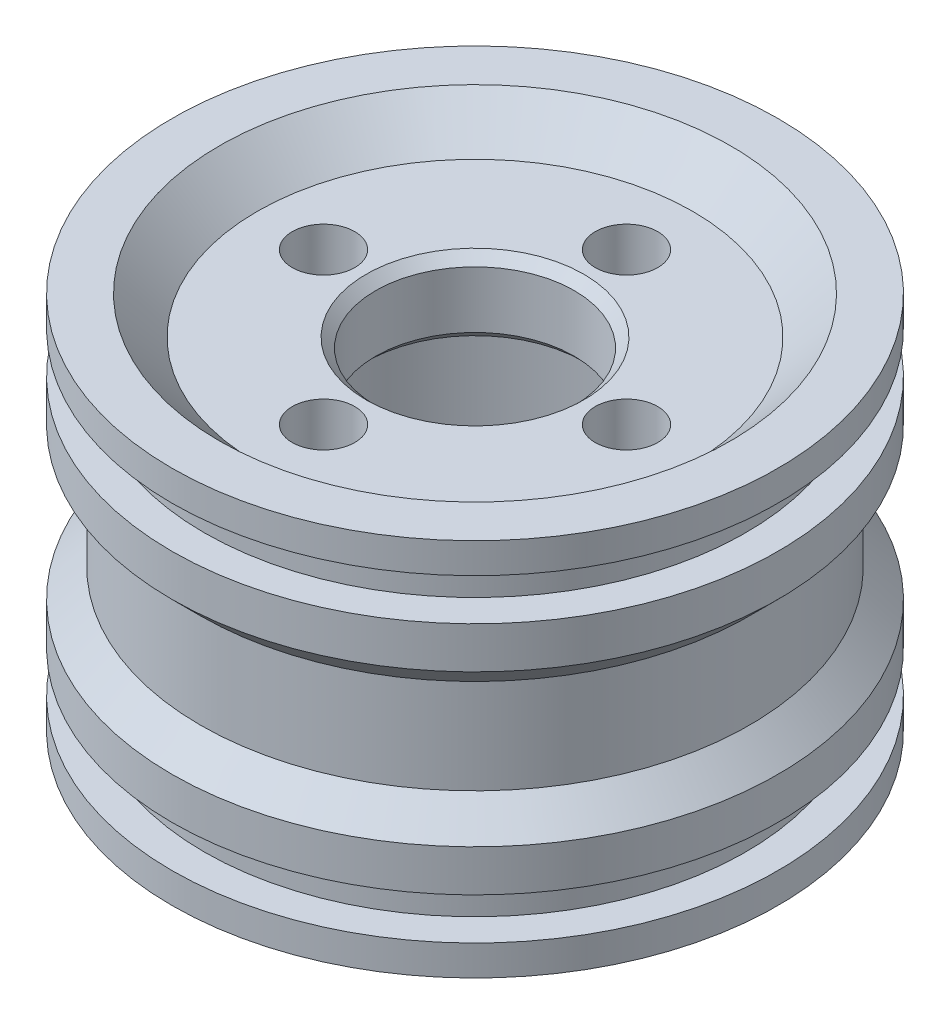
ISO-10303-21;
HEADER;
FILE_DESCRIPTION(('STEP AP214'),'2;1');
FILE_NAME('part.step','',(''),(''),'','','');
FILE_SCHEMA(('AUTOMOTIVE_DESIGN { 1 0 10303 214 1 1 1 1 }'));
ENDSEC;
DATA;
#1=APPLICATION_CONTEXT('core data for automotive mechanical design processes');
#2=APPLICATION_PROTOCOL_DEFINITION('international standard','automotive_design',2000,#1);
#3=PRODUCT_CONTEXT('',#1,'mechanical');
#4=PRODUCT('Part','Part','',(#3));
#5=PRODUCT_RELATED_PRODUCT_CATEGORY('part','',(#4));
#6=PRODUCT_DEFINITION_FORMATION('','',#4);
#7=PRODUCT_DEFINITION_CONTEXT('part definition',#1,'design');
#8=PRODUCT_DEFINITION('design','',#6,#7);
#9=PRODUCT_DEFINITION_SHAPE('','',#8);
#10=(LENGTH_UNIT() NAMED_UNIT(*) SI_UNIT(.MILLI.,.METRE.));
#11=(NAMED_UNIT(*) PLANE_ANGLE_UNIT() SI_UNIT($,.RADIAN.));
#12=(NAMED_UNIT(*) SI_UNIT($,.STERADIAN.) SOLID_ANGLE_UNIT());
#13=UNCERTAINTY_MEASURE_WITH_UNIT(LENGTH_MEASURE(1.E-05),#10,'distance_accuracy_value','');
#14=(GEOMETRIC_REPRESENTATION_CONTEXT(3) GLOBAL_UNCERTAINTY_ASSIGNED_CONTEXT((#13)) GLOBAL_UNIT_ASSIGNED_CONTEXT((#10,
#11,#12)) REPRESENTATION_CONTEXT('',''));
#15=CARTESIAN_POINT('',(0.,0.,0.));
#16=DIRECTION('',(0.,0.,1.));
#17=DIRECTION('',(1.,0.,0.));
#18=AXIS2_PLACEMENT_3D('',#15,#16,#17);
#19=CARTESIAN_POINT('',(0.,10.,0.));
#20=DIRECTION('',(0.,-1.,0.));
#21=DIRECTION('',(0.,0.,-1.));
#22=AXIS2_PLACEMENT_3D('',#19,#20,#21);
#23=CYLINDRICAL_SURFACE('',#22,16.);
#24=CARTESIAN_POINT('',(0.,-4.,0.));
#25=DIRECTION('',(0.,-1.,0.));
#26=DIRECTION('',(0.,0.,-1.));
#27=AXIS2_PLACEMENT_3D('',#24,#25,#26);
#28=CIRCLE('',#27,16.);
#29=CARTESIAN_POINT('',(0.,-4.,-16.));
#30=VERTEX_POINT('',#29);
#31=EDGE_CURVE('E136',#30,#30,#28,.T.);
#32=ORIENTED_EDGE('',*,*,#31,.T.);
#33=EDGE_LOOP('',(#32));
#34=FACE_BOUND('',#33,.T.);
#35=CARTESIAN_POINT('',(0.,-6.2,0.));
#36=DIRECTION('',(0.,1.,0.));
#37=DIRECTION('',(0.,0.,1.));
#38=AXIS2_PLACEMENT_3D('',#35,#36,#37);
#39=CIRCLE('',#38,16.);
#40=CARTESIAN_POINT('',(0.,-6.2,16.));
#41=VERTEX_POINT('',#40);
#42=EDGE_CURVE('E116',#41,#41,#39,.T.);
#43=ORIENTED_EDGE('',*,*,#42,.T.);
#44=EDGE_LOOP('',(#43));
#45=FACE_BOUND('',#44,.T.);
#46=ADVANCED_FACE('F41',(#34,#45),#23,.T.);
#47=CARTESIAN_POINT('',(0.,-5.,0.));
#48=DIRECTION('',(0.,1.,0.));
#49=DIRECTION('',(0.,0.,1.));
#50=AXIS2_PLACEMENT_3D('',#47,#48,#49);
#51=CYLINDRICAL_SURFACE('',#50,5.25);
#52=CARTESIAN_POINT('',(0.,7.49999999999999,0.));
#53=DIRECTION('',(0.,1.,0.));
#54=DIRECTION('',(0.,0.,1.));
#55=AXIS2_PLACEMENT_3D('',#52,#53,#54);
#56=CIRCLE('',#55,5.25);
#57=CARTESIAN_POINT('',(0.,7.49999999999999,5.25));
#58=VERTEX_POINT('',#57);
#59=EDGE_CURVE('E57',#58,#58,#56,.T.);
#60=ORIENTED_EDGE('',*,*,#59,.T.);
#61=EDGE_LOOP('',(#60));
#62=FACE_BOUND('',#61,.T.);
#63=CARTESIAN_POINT('',(0.,4.5,0.));
#64=DIRECTION('',(0.,-1.,0.));
#65=DIRECTION('',(0.,0.,-1.));
#66=AXIS2_PLACEMENT_3D('',#63,#64,#65);
#67=CIRCLE('',#66,5.25);
#68=CARTESIAN_POINT('',(0.,4.5,-5.25));
#69=VERTEX_POINT('',#68);
#70=EDGE_CURVE('E62',#69,#69,#67,.T.);
#71=ORIENTED_EDGE('',*,*,#70,.T.);
#72=EDGE_LOOP('',(#71));
#73=FACE_BOUND('',#72,.T.);
#74=ADVANCED_FACE('F154',(#62,#73),#51,.F.);
#75=CARTESIAN_POINT('',(0.,4.,0.));
#76=DIRECTION('',(0.,-1.,0.));
#77=DIRECTION('',(0.,0.,-1.));
#78=AXIS2_PLACEMENT_3D('',#75,#76,#77);
#79=CIRCLE('',#78,16.);
#80=CARTESIAN_POINT('',(0.,4.,-16.));
#81=VERTEX_POINT('',#80);
#82=EDGE_CURVE('E143',#81,#81,#79,.T.);
#83=ORIENTED_EDGE('',*,*,#82,.F.);
#84=EDGE_LOOP('',(#83));
#85=FACE_BOUND('',#84,.T.);
#86=CARTESIAN_POINT('',(0.,6.2,0.));
#87=DIRECTION('',(0.,1.,0.));
#88=DIRECTION('',(0.,0.,1.));
#89=AXIS2_PLACEMENT_3D('',#86,#87,#88);
#90=CIRCLE('',#89,16.);
#91=CARTESIAN_POINT('',(0.,6.2,16.));
#92=VERTEX_POINT('',#91);
#93=EDGE_CURVE('E102',#92,#92,#90,.T.);
#94=ORIENTED_EDGE('',*,*,#93,.F.);
#95=EDGE_LOOP('',(#94));
#96=FACE_BOUND('',#95,.T.);
#97=ADVANCED_FACE('F150',(#85,#96),#23,.T.);
#98=CARTESIAN_POINT('',(16.,6.2,0.));
#99=DIRECTION('',(0.,1.,0.));
#100=DIRECTION('',(0.,0.,1.));
#101=AXIS2_PLACEMENT_3D('',#98,#99,#100);
#102=PLANE('',#101);
#103=ORIENTED_EDGE('',*,*,#93,.T.);
#104=EDGE_LOOP('',(#103));
#105=FACE_BOUND('',#104,.T.);
#106=CARTESIAN_POINT('',(0.,6.2,0.));
#107=DIRECTION('',(0.,1.,0.));
#108=DIRECTION('',(0.,0.,1.));
#109=AXIS2_PLACEMENT_3D('',#106,#107,#108);
#110=CIRCLE('',#109,14.3);
#111=CARTESIAN_POINT('',(0.,6.2,14.3));
#112=VERTEX_POINT('',#111);
#113=EDGE_CURVE('E107',#112,#112,#110,.T.);
#114=ORIENTED_EDGE('',*,*,#113,.F.);
#115=EDGE_LOOP('',(#114));
#116=FACE_BOUND('',#115,.T.);
#117=ADVANCED_FACE('F153',(#105,#116),#102,.T.);
#118=CARTESIAN_POINT('',(0.,8.4,0.));
#119=DIRECTION('',(0.,1.,0.));
#120=DIRECTION('',(0.,0.,1.));
#121=AXIS2_PLACEMENT_3D('',#118,#119,#120);
#122=CYLINDRICAL_SURFACE('',#121,14.3);
#123=ORIENTED_EDGE('',*,*,#113,.T.);
#124=EDGE_LOOP('',(#123));
#125=FACE_BOUND('',#124,.T.);
#126=CARTESIAN_POINT('',(0.,8.4,0.));
#127=DIRECTION('',(0.,1.,0.));
#128=DIRECTION('',(0.,0.,1.));
#129=AXIS2_PLACEMENT_3D('',#126,#127,#128);
#130=CIRCLE('',#129,14.3);
#131=CARTESIAN_POINT('',(0.,8.4,14.3));
#132=VERTEX_POINT('',#131);
#133=EDGE_CURVE('E110',#132,#132,#130,.T.);
#134=ORIENTED_EDGE('',*,*,#133,.F.);
#135=EDGE_LOOP('',(#134));
#136=FACE_BOUND('',#135,.T.);
#137=ADVANCED_FACE('F161',(#125,#136),#122,.T.);
#138=CARTESIAN_POINT('',(16.,8.4,0.));
#139=DIRECTION('',(0.,-1.,0.));
#140=DIRECTION('',(0.,0.,-1.));
#141=AXIS2_PLACEMENT_3D('',#138,#139,#140);
#142=PLANE('',#141);
#143=ORIENTED_EDGE('',*,*,#133,.T.);
#144=EDGE_LOOP('',(#143));
#145=FACE_BOUND('',#144,.T.);
#146=CARTESIAN_POINT('',(0.,8.4,0.));
#147=DIRECTION('',(0.,1.,0.));
#148=DIRECTION('',(0.,0.,1.));
#149=AXIS2_PLACEMENT_3D('',#146,#147,#148);
#150=CIRCLE('',#149,16.);
#151=CARTESIAN_POINT('',(0.,8.4,16.));
#152=VERTEX_POINT('',#151);
#153=EDGE_CURVE('E113',#152,#152,#150,.T.);
#154=ORIENTED_EDGE('',*,*,#153,.F.);
#155=EDGE_LOOP('',(#154));
#156=FACE_BOUND('',#155,.T.);
#157=ADVANCED_FACE('F167',(#145,#156),#142,.T.);
#158=CARTESIAN_POINT('',(0.,10.,0.));
#159=DIRECTION('',(0.,1.,0.));
#160=DIRECTION('',(0.,0.,1.));
#161=AXIS2_PLACEMENT_3D('',#158,#159,#160);
#162=PLANE('',#161);
#163=CARTESIAN_POINT('',(0.,10.,0.));
#164=DIRECTION('',(0.,1.,0.));
#165=DIRECTION('',(0.,0.,1.));
#166=AXIS2_PLACEMENT_3D('',#163,#164,#165);
#167=CIRCLE('',#166,13.5);
#168=CARTESIAN_POINT('',(0.,10.,13.5));
#169=VERTEX_POINT('',#168);
#170=EDGE_CURVE('E74',#169,#169,#167,.F.);
#171=ORIENTED_EDGE('',*,*,#170,.T.);
#172=EDGE_LOOP('',(#171));
#173=FACE_BOUND('',#172,.T.);
#174=CARTESIAN_POINT('',(0.,10.,0.));
#175=DIRECTION('',(0.,1.,0.));
#176=DIRECTION('',(0.,0.,1.));
#177=AXIS2_PLACEMENT_3D('',#174,#175,#176);
#178=CIRCLE('',#177,16.);
#179=CARTESIAN_POINT('',(0.,10.,16.));
#180=VERTEX_POINT('',#179);
#181=EDGE_CURVE('E98',#180,#180,#178,.T.);
#182=ORIENTED_EDGE('',*,*,#181,.T.);
#183=EDGE_LOOP('',(#182));
#184=FACE_BOUND('',#183,.T.);
#185=ADVANCED_FACE('F173',(#173,#184),#162,.T.);
#186=ORIENTED_EDGE('',*,*,#181,.F.);
#187=EDGE_LOOP('',(#186));
#188=FACE_BOUND('',#187,.T.);
#189=ORIENTED_EDGE('',*,*,#153,.T.);
#190=EDGE_LOOP('',(#189));
#191=FACE_BOUND('',#190,.T.);
#192=ADVANCED_FACE('F156',(#188,#191),#23,.T.);
#193=CARTESIAN_POINT('',(16.,-6.2,0.));
#194=DIRECTION('',(0.,-1.,0.));
#195=DIRECTION('',(0.,0.,1.));
#196=AXIS2_PLACEMENT_3D('',#193,#194,#195);
#197=PLANE('',#196);
#198=ORIENTED_EDGE('',*,*,#42,.F.);
#199=EDGE_LOOP('',(#198));
#200=FACE_BOUND('',#199,.T.);
#201=CARTESIAN_POINT('',(0.,-6.2,0.));
#202=DIRECTION('',(0.,1.,0.));
#203=DIRECTION('',(0.,0.,1.));
#204=AXIS2_PLACEMENT_3D('',#201,#202,#203);
#205=CIRCLE('',#204,14.3);
#206=CARTESIAN_POINT('',(0.,-6.2,14.3));
#207=VERTEX_POINT('',#206);
#208=EDGE_CURVE('E119',#207,#207,#205,.T.);
#209=ORIENTED_EDGE('',*,*,#208,.T.);
#210=EDGE_LOOP('',(#209));
#211=FACE_BOUND('',#210,.T.);
#212=ADVANCED_FACE('F178',(#200,#211),#197,.T.);
#213=CARTESIAN_POINT('',(0.,-8.4,0.));
#214=DIRECTION('',(0.,-1.,0.));
#215=DIRECTION('',(0.,0.,1.));
#216=AXIS2_PLACEMENT_3D('',#213,#214,#215);
#217=CYLINDRICAL_SURFACE('',#216,14.3);
#218=ORIENTED_EDGE('',*,*,#208,.F.);
#219=EDGE_LOOP('',(#218));
#220=FACE_BOUND('',#219,.T.);
#221=CARTESIAN_POINT('',(0.,-8.4,0.));
#222=DIRECTION('',(0.,1.,0.));
#223=DIRECTION('',(0.,0.,1.));
#224=AXIS2_PLACEMENT_3D('',#221,#222,#223);
#225=CIRCLE('',#224,14.3);
#226=CARTESIAN_POINT('',(0.,-8.4,14.3));
#227=VERTEX_POINT('',#226);
#228=EDGE_CURVE('E122',#227,#227,#225,.T.);
#229=ORIENTED_EDGE('',*,*,#228,.T.);
#230=EDGE_LOOP('',(#229));
#231=FACE_BOUND('',#230,.T.);
#232=ADVANCED_FACE('F184',(#220,#231),#217,.T.);
#233=CARTESIAN_POINT('',(16.,-8.4,0.));
#234=DIRECTION('',(0.,1.,0.));
#235=DIRECTION('',(0.,0.,-1.));
#236=AXIS2_PLACEMENT_3D('',#233,#234,#235);
#237=PLANE('',#236);
#238=ORIENTED_EDGE('',*,*,#228,.F.);
#239=EDGE_LOOP('',(#238));
#240=FACE_BOUND('',#239,.T.);
#241=CARTESIAN_POINT('',(0.,-8.4,0.));
#242=DIRECTION('',(0.,1.,0.));
#243=DIRECTION('',(0.,0.,1.));
#244=AXIS2_PLACEMENT_3D('',#241,#242,#243);
#245=CIRCLE('',#244,16.);
#246=CARTESIAN_POINT('',(0.,-8.4,16.));
#247=VERTEX_POINT('',#246);
#248=EDGE_CURVE('E125',#247,#247,#245,.T.);
#249=ORIENTED_EDGE('',*,*,#248,.T.);
#250=EDGE_LOOP('',(#249));
#251=FACE_BOUND('',#250,.T.);
#252=ADVANCED_FACE('F213',(#240,#251),#237,.T.);
#253=CARTESIAN_POINT('',(0.,-10.,0.));
#254=DIRECTION('',(0.,1.,0.));
#255=DIRECTION('',(0.,0.,1.));
#256=AXIS2_PLACEMENT_3D('',#253,#254,#255);
#257=PLANE('',#256);
#258=CARTESIAN_POINT('',(0.,-10.,0.));
#259=DIRECTION('',(0.,1.,0.));
#260=DIRECTION('',(0.,0.,1.));
#261=AXIS2_PLACEMENT_3D('',#258,#259,#260);
#262=CIRCLE('',#261,13.5);
#263=CARTESIAN_POINT('',(0.,-10.,13.5));
#264=VERTEX_POINT('',#263);
#265=EDGE_CURVE('E92',#264,#264,#262,.T.);
#266=ORIENTED_EDGE('',*,*,#265,.T.);
#267=EDGE_LOOP('',(#266));
#268=FACE_BOUND('',#267,.T.);
#269=CARTESIAN_POINT('',(0.,-10.,0.));
#270=DIRECTION('',(0.,1.,0.));
#271=DIRECTION('',(0.,0.,1.));
#272=AXIS2_PLACEMENT_3D('',#269,#270,#271);
#273=CIRCLE('',#272,16.);
#274=CARTESIAN_POINT('',(0.,-10.,16.));
#275=VERTEX_POINT('',#274);
#276=EDGE_CURVE('E99',#275,#275,#273,.T.);
#277=ORIENTED_EDGE('',*,*,#276,.F.);
#278=EDGE_LOOP('',(#277));
#279=FACE_BOUND('',#278,.T.);
#280=ADVANCED_FACE('F195',(#268,#279),#257,.F.);
#281=ORIENTED_EDGE('',*,*,#276,.T.);
#282=EDGE_LOOP('',(#281));
#283=FACE_BOUND('',#282,.T.);
#284=ORIENTED_EDGE('',*,*,#248,.F.);
#285=EDGE_LOOP('',(#284));
#286=FACE_BOUND('',#285,.T.);
#287=ADVANCED_FACE('F180',(#283,#286),#23,.T.);
#288=CARTESIAN_POINT('',(0.,4.,0.));
#289=DIRECTION('',(0.,-1.,0.));
#290=DIRECTION('',(0.,0.,-1.));
#291=AXIS2_PLACEMENT_3D('',#288,#289,#290);
#292=CYLINDRICAL_SURFACE('',#291,11.5);
#293=CARTESIAN_POINT('',(0.,3.50000000000002,0.));
#294=DIRECTION('',(0.,-1.,0.));
#295=DIRECTION('',(0.,0.,-1.));
#296=AXIS2_PLACEMENT_3D('',#293,#294,#295);
#297=CIRCLE('',#296,11.5);
#298=CARTESIAN_POINT('',(0.,3.50000000000002,-11.5));
#299=VERTEX_POINT('',#298);
#300=EDGE_CURVE('E10',#299,#299,#297,.F.);
#301=ORIENTED_EDGE('',*,*,#300,.T.);
#302=EDGE_LOOP('',(#301));
#303=FACE_BOUND('',#302,.T.);
#304=CARTESIAN_POINT('',(0.,-8.,0.));
#305=DIRECTION('',(0.,1.,0.));
#306=DIRECTION('',(0.,0.,1.));
#307=AXIS2_PLACEMENT_3D('',#304,#305,#306);
#308=CIRCLE('',#307,11.5);
#309=CARTESIAN_POINT('',(0.,-8.,11.5));
#310=VERTEX_POINT('',#309);
#311=EDGE_CURVE('E95',#310,#310,#308,.F.);
#312=ORIENTED_EDGE('',*,*,#311,.T.);
#313=EDGE_LOOP('',(#312));
#314=FACE_BOUND('',#313,.T.);
#315=ADVANCED_FACE('F194',(#303,#314),#292,.F.);
#316=CARTESIAN_POINT('',(0.,4.,0.));
#317=DIRECTION('',(0.,-1.,0.));
#318=DIRECTION('',(0.,0.,-1.));
#319=AXIS2_PLACEMENT_3D('',#316,#317,#318);
#320=PLANE('',#319);
#321=CARTESIAN_POINT('',(0.,4.,0.));
#322=DIRECTION('',(0.,-1.,0.));
#323=DIRECTION('',(0.,0.,-1.));
#324=AXIS2_PLACEMENT_3D('',#321,#322,#323);
#325=CIRCLE('',#324,5.75000000000001);
#326=CARTESIAN_POINT('',(0.,4.,-5.75000000000001));
#327=VERTEX_POINT('',#326);
#328=EDGE_CURVE('E49',#327,#327,#325,.F.);
#329=ORIENTED_EDGE('',*,*,#328,.T.);
#330=EDGE_LOOP('',(#329));
#331=FACE_BOUND('',#330,.T.);
#332=CARTESIAN_POINT('',(0.,4.,0.));
#333=DIRECTION('',(0.,-1.,0.));
#334=DIRECTION('',(0.,0.,-1.));
#335=AXIS2_PLACEMENT_3D('',#332,#333,#334);
#336=CIRCLE('',#335,11.);
#337=CARTESIAN_POINT('',(0.,4.,-11.));
#338=VERTEX_POINT('',#337);
#339=EDGE_CURVE('E53',#338,#338,#336,.T.);
#340=ORIENTED_EDGE('',*,*,#339,.T.);
#341=EDGE_LOOP('',(#340));
#342=FACE_BOUND('',#341,.T.);
#343=CARTESIAN_POINT('',(0.,4.,8.));
#344=DIRECTION('',(0.,-1.,0.));
#345=DIRECTION('',(-1.,0.,0.));
#346=AXIS2_PLACEMENT_3D('',#343,#344,#345);
#347=CIRCLE('',#346,1.65);
#348=CARTESIAN_POINT('',(-1.64999999999997,4.,8.00000000000001));
#349=VERTEX_POINT('',#348);
#350=EDGE_CURVE('E85',#349,#349,#347,.T.);
#351=ORIENTED_EDGE('',*,*,#350,.F.);
#352=EDGE_LOOP('',(#351));
#353=FACE_BOUND('',#352,.T.);
#354=CARTESIAN_POINT('',(8.,4.,0.));
#355=DIRECTION('',(0.,-1.,0.));
#356=DIRECTION('',(0.,0.,1.));
#357=AXIS2_PLACEMENT_3D('',#354,#355,#356);
#358=CIRCLE('',#357,1.65);
#359=CARTESIAN_POINT('',(8.,4.,1.65));
#360=VERTEX_POINT('',#359);
#361=EDGE_CURVE('E135',#360,#360,#358,.T.);
#362=ORIENTED_EDGE('',*,*,#361,.F.);
#363=EDGE_LOOP('',(#362));
#364=FACE_BOUND('',#363,.T.);
#365=CARTESIAN_POINT('',(0.,4.,-8.));
#366=DIRECTION('',(0.,-1.,0.));
#367=DIRECTION('',(1.,0.,0.));
#368=AXIS2_PLACEMENT_3D('',#365,#366,#367);
#369=CIRCLE('',#368,1.65);
#370=CARTESIAN_POINT('',(1.64999999999992,4.,-8.00000000000002));
#371=VERTEX_POINT('',#370);
#372=EDGE_CURVE('E132',#371,#371,#369,.T.);
#373=ORIENTED_EDGE('',*,*,#372,.F.);
#374=EDGE_LOOP('',(#373));
#375=FACE_BOUND('',#374,.T.);
#376=CARTESIAN_POINT('',(-8.,4.,0.));
#377=DIRECTION('',(0.,-1.,0.));
#378=DIRECTION('',(0.,0.,-1.));
#379=AXIS2_PLACEMENT_3D('',#376,#377,#378);
#380=CIRCLE('',#379,1.65);
#381=CARTESIAN_POINT('',(-8.,4.,-1.65));
#382=VERTEX_POINT('',#381);
#383=EDGE_CURVE('E78',#382,#382,#380,.T.);
#384=ORIENTED_EDGE('',*,*,#383,.F.);
#385=EDGE_LOOP('',(#384));
#386=FACE_BOUND('',#385,.T.);
#387=ADVANCED_FACE('F229',(#331,#342,#353,#364,#375,#386),#320,.T.);
#388=CARTESIAN_POINT('',(0.,-8.,0.));
#389=DIRECTION('',(0.,-1.,0.));
#390=DIRECTION('',(0.,0.,-1.));
#391=AXIS2_PLACEMENT_3D('',#388,#389,#390);
#392=CONICAL_SURFACE('',#391,11.5,0.78539816339745);
#393=ORIENTED_EDGE('',*,*,#265,.F.);
#394=EDGE_LOOP('',(#393));
#395=FACE_BOUND('',#394,.T.);
#396=ORIENTED_EDGE('',*,*,#311,.F.);
#397=EDGE_LOOP('',(#396));
#398=FACE_BOUND('',#397,.T.);
#399=ADVANCED_FACE('F231',(#395,#398),#392,.F.);
#400=CARTESIAN_POINT('',(0.,8.,0.));
#401=DIRECTION('',(0.,1.,0.));
#402=DIRECTION('',(0.,0.,1.));
#403=AXIS2_PLACEMENT_3D('',#400,#401,#402);
#404=PLANE('',#403);
#405=CARTESIAN_POINT('',(0.,8.,0.));
#406=DIRECTION('',(0.,1.,0.));
#407=DIRECTION('',(0.,0.,1.));
#408=AXIS2_PLACEMENT_3D('',#405,#406,#407);
#409=CIRCLE('',#408,5.75000000000001);
#410=CARTESIAN_POINT('',(0.,8.,5.75000000000001));
#411=VERTEX_POINT('',#410);
#412=EDGE_CURVE('E65',#411,#411,#409,.F.);
#413=ORIENTED_EDGE('',*,*,#412,.T.);
#414=EDGE_LOOP('',(#413));
#415=FACE_BOUND('',#414,.T.);
#416=CARTESIAN_POINT('',(0.,8.,8.));
#417=DIRECTION('',(0.,1.,0.));
#418=DIRECTION('',(0.,0.,1.));
#419=AXIS2_PLACEMENT_3D('',#416,#417,#418);
#420=CIRCLE('',#419,1.65);
#421=CARTESIAN_POINT('',(0.,8.,9.65));
#422=VERTEX_POINT('',#421);
#423=EDGE_CURVE('E75',#422,#422,#420,.T.);
#424=ORIENTED_EDGE('',*,*,#423,.F.);
#425=EDGE_LOOP('',(#424));
#426=FACE_BOUND('',#425,.T.);
#427=CARTESIAN_POINT('',(8.,8.,0.));
#428=DIRECTION('',(0.,1.,0.));
#429=DIRECTION('',(0.,0.,1.));
#430=AXIS2_PLACEMENT_3D('',#427,#428,#429);
#431=CIRCLE('',#430,1.65);
#432=CARTESIAN_POINT('',(8.,8.,1.65));
#433=VERTEX_POINT('',#432);
#434=EDGE_CURVE('E79',#433,#433,#431,.T.);
#435=ORIENTED_EDGE('',*,*,#434,.F.);
#436=EDGE_LOOP('',(#435));
#437=FACE_BOUND('',#436,.T.);
#438=CARTESIAN_POINT('',(0.,8.,-8.));
#439=DIRECTION('',(0.,1.,0.));
#440=DIRECTION('',(0.,0.,1.));
#441=AXIS2_PLACEMENT_3D('',#438,#439,#440);
#442=CIRCLE('',#441,1.65);
#443=CARTESIAN_POINT('',(0.,8.,-6.35));
#444=VERTEX_POINT('',#443);
#445=EDGE_CURVE('E82',#444,#444,#442,.T.);
#446=ORIENTED_EDGE('',*,*,#445,.F.);
#447=EDGE_LOOP('',(#446));
#448=FACE_BOUND('',#447,.T.);
#449=CARTESIAN_POINT('',(-8.,8.,0.));
#450=DIRECTION('',(0.,1.,0.));
#451=DIRECTION('',(0.,0.,1.));
#452=AXIS2_PLACEMENT_3D('',#449,#450,#451);
#453=CIRCLE('',#452,1.65);
#454=CARTESIAN_POINT('',(-8.,8.,1.65));
#455=VERTEX_POINT('',#454);
#456=EDGE_CURVE('E86',#455,#455,#453,.T.);
#457=ORIENTED_EDGE('',*,*,#456,.F.);
#458=EDGE_LOOP('',(#457));
#459=FACE_BOUND('',#458,.T.);
#460=CARTESIAN_POINT('',(0.,8.,0.));
#461=DIRECTION('',(0.,1.,0.));
#462=DIRECTION('',(0.,0.,1.));
#463=AXIS2_PLACEMENT_3D('',#460,#461,#462);
#464=CIRCLE('',#463,11.5);
#465=CARTESIAN_POINT('',(0.,8.,11.5));
#466=VERTEX_POINT('',#465);
#467=EDGE_CURVE('E89',#466,#466,#464,.T.);
#468=ORIENTED_EDGE('',*,*,#467,.T.);
#469=EDGE_LOOP('',(#468));
#470=FACE_BOUND('',#469,.T.);
#471=ADVANCED_FACE('F233',(#415,#426,#437,#448,#459,#470),#404,.T.);
#472=CARTESIAN_POINT('',(0.,8.,0.));
#473=DIRECTION('',(0.,1.,0.));
#474=DIRECTION('',(0.,0.,1.));
#475=AXIS2_PLACEMENT_3D('',#472,#473,#474);
#476=CONICAL_SURFACE('',#475,11.5,0.78539816339745);
#477=ORIENTED_EDGE('',*,*,#170,.F.);
#478=EDGE_LOOP('',(#477));
#479=FACE_BOUND('',#478,.T.);
#480=ORIENTED_EDGE('',*,*,#467,.F.);
#481=EDGE_LOOP('',(#480));
#482=FACE_BOUND('',#481,.T.);
#483=ADVANCED_FACE('F236',(#479,#482),#476,.F.);
#484=CARTESIAN_POINT('',(-8.,14.,0.));
#485=DIRECTION('',(0.,-1.,0.));
#486=DIRECTION('',(0.,0.,-1.));
#487=AXIS2_PLACEMENT_3D('',#484,#485,#486);
#488=CYLINDRICAL_SURFACE('',#487,1.65);
#489=ORIENTED_EDGE('',*,*,#456,.T.);
#490=EDGE_LOOP('',(#489));
#491=FACE_BOUND('',#490,.T.);
#492=ORIENTED_EDGE('',*,*,#383,.T.);
#493=EDGE_LOOP('',(#492));
#494=FACE_BOUND('',#493,.T.);
#495=ADVANCED_FACE('F238',(#491,#494),#488,.F.);
#496=CARTESIAN_POINT('',(0.,14.,-8.));
#497=DIRECTION('',(0.,-1.,0.));
#498=DIRECTION('',(0.,0.,-1.));
#499=AXIS2_PLACEMENT_3D('',#496,#497,#498);
#500=CYLINDRICAL_SURFACE('',#499,1.65);
#501=ORIENTED_EDGE('',*,*,#445,.T.);
#502=EDGE_LOOP('',(#501));
#503=FACE_BOUND('',#502,.T.);
#504=ORIENTED_EDGE('',*,*,#372,.T.);
#505=EDGE_LOOP('',(#504));
#506=FACE_BOUND('',#505,.T.);
#507=ADVANCED_FACE('F241',(#503,#506),#500,.F.);
#508=CARTESIAN_POINT('',(8.,14.,0.));
#509=DIRECTION('',(0.,-1.,0.));
#510=DIRECTION('',(0.,0.,-1.));
#511=AXIS2_PLACEMENT_3D('',#508,#509,#510);
#512=CYLINDRICAL_SURFACE('',#511,1.65);
#513=ORIENTED_EDGE('',*,*,#434,.T.);
#514=EDGE_LOOP('',(#513));
#515=FACE_BOUND('',#514,.T.);
#516=ORIENTED_EDGE('',*,*,#361,.T.);
#517=EDGE_LOOP('',(#516));
#518=FACE_BOUND('',#517,.T.);
#519=ADVANCED_FACE('F245',(#515,#518),#512,.F.);
#520=CARTESIAN_POINT('',(0.,14.,8.));
#521=DIRECTION('',(0.,-1.,0.));
#522=DIRECTION('',(0.,0.,-1.));
#523=AXIS2_PLACEMENT_3D('',#520,#521,#522);
#524=CYLINDRICAL_SURFACE('',#523,1.65);
#525=ORIENTED_EDGE('',*,*,#423,.T.);
#526=EDGE_LOOP('',(#525));
#527=FACE_BOUND('',#526,.T.);
#528=ORIENTED_EDGE('',*,*,#350,.T.);
#529=EDGE_LOOP('',(#528));
#530=FACE_BOUND('',#529,.T.);
#531=ADVANCED_FACE('F249',(#527,#530),#524,.F.);
#532=CARTESIAN_POINT('',(0.,4.,0.));
#533=DIRECTION('',(0.,-1.,0.));
#534=DIRECTION('',(0.,0.,-1.));
#535=AXIS2_PLACEMENT_3D('',#532,#533,#534);
#536=CYLINDRICAL_SURFACE('',#535,14.5);
#537=CARTESIAN_POINT('',(0.,2.49999999999999,0.));
#538=DIRECTION('',(0.,1.,0.));
#539=DIRECTION('',(0.,0.,1.));
#540=AXIS2_PLACEMENT_3D('',#537,#538,#539);
#541=CIRCLE('',#540,14.5);
#542=CARTESIAN_POINT('',(0.,2.49999999999999,-14.5));
#543=VERTEX_POINT('',#542);
#544=EDGE_CURVE('E68',#543,#543,#541,.F.);
#545=CARTESIAN_POINT('',(0.,-2.5,0.));
#546=DIRECTION('',(0.,-1.,0.));
#547=DIRECTION('',(0.,0.,-1.));
#548=AXIS2_PLACEMENT_3D('',#545,#546,#547);
#549=CIRCLE('',#548,14.5);
#550=CARTESIAN_POINT('',(0.,-2.5,-14.5));
#551=VERTEX_POINT('',#550);
#552=EDGE_CURVE('E71',#551,#551,#549,.F.);
#553=CARTESIAN_POINT('',(0.,2.49999999999999,-14.5));
#554=CARTESIAN_POINT('',(0.,2.44791666666665,-14.5));
#555=CARTESIAN_POINT('',(0.,2.39583333333332,-14.5));
#556=CARTESIAN_POINT('',(0.,2.29166666666665,-14.5));
#557=CARTESIAN_POINT('',(0.,2.23958333333332,-14.5));
#558=CARTESIAN_POINT('',(0.,2.13541666666666,-14.5));
#559=CARTESIAN_POINT('',(0.,2.08333333333332,-14.5));
#560=CARTESIAN_POINT('',(0.,1.97916666666666,-14.5));
#561=CARTESIAN_POINT('',(0.,1.92708333333332,-14.5));
#562=CARTESIAN_POINT('',(0.,1.82291666666666,-14.5));
#563=CARTESIAN_POINT('',(0.,1.77083333333332,-14.5));
#564=CARTESIAN_POINT('',(0.,1.66666666666666,-14.5));
#565=CARTESIAN_POINT('',(0.,1.61458333333332,-14.5));
#566=CARTESIAN_POINT('',(0.,1.51041666666666,-14.5));
#567=CARTESIAN_POINT('',(0.,1.45833333333332,-14.5));
#568=CARTESIAN_POINT('',(0.,1.35416666666666,-14.5));
#569=CARTESIAN_POINT('',(0.,1.30208333333332,-14.5));
#570=CARTESIAN_POINT('',(0.,1.19791666666666,-14.5));
#571=CARTESIAN_POINT('',(0.,1.14583333333333,-14.5));
#572=CARTESIAN_POINT('',(0.,1.04166666666666,-14.5));
#573=CARTESIAN_POINT('',(0.,0.989583333333326,-14.5));
#574=CARTESIAN_POINT('',(0.,0.885416666666659,-14.5));
#575=CARTESIAN_POINT('',(0.,0.833333333333326,-14.5));
#576=CARTESIAN_POINT('',(0.,0.72916666666666,-14.5));
#577=CARTESIAN_POINT('',(0.,0.677083333333327,-14.5));
#578=CARTESIAN_POINT('',(0.,0.57291666666666,-14.5));
#579=CARTESIAN_POINT('',(0.,0.520833333333327,-14.5));
#580=CARTESIAN_POINT('',(0.,0.416666666666661,-14.5));
#581=CARTESIAN_POINT('',(0.,0.364583333333327,-14.5));
#582=CARTESIAN_POINT('',(0.,0.260416666666661,-14.5));
#583=CARTESIAN_POINT('',(0.,0.208333333333328,-14.5));
#584=CARTESIAN_POINT('',(0.,0.104166666666662,-14.5));
#585=CARTESIAN_POINT('',(0.,0.0520833333333282,-14.5));
#586=CARTESIAN_POINT('',(0.,-0.0520833333333383,-14.5));
#587=CARTESIAN_POINT('',(0.,-0.104166666666671,-14.5));
#588=CARTESIAN_POINT('',(0.,-0.208333333333338,-14.5));
#589=CARTESIAN_POINT('',(0.,-0.260416666666671,-14.5));
#590=CARTESIAN_POINT('',(0.,-0.364583333333337,-14.5));
#591=CARTESIAN_POINT('',(0.,-0.416666666666671,-14.5));
#592=CARTESIAN_POINT('',(0.,-0.520833333333337,-14.5));
#593=CARTESIAN_POINT('',(0.,-0.57291666666667,-14.5));
#594=CARTESIAN_POINT('',(0.,-0.677083333333336,-14.5));
#595=CARTESIAN_POINT('',(0.,-0.729166666666669,-14.5));
#596=CARTESIAN_POINT('',(0.,-0.833333333333336,-14.5));
#597=CARTESIAN_POINT('',(0.,-0.885416666666669,-14.5));
#598=CARTESIAN_POINT('',(0.,-0.989583333333335,-14.5));
#599=CARTESIAN_POINT('',(0.,-1.04166666666667,-14.5));
#600=CARTESIAN_POINT('',(0.,-1.14583333333333,-14.5));
#601=CARTESIAN_POINT('',(0.,-1.19791666666667,-14.5));
#602=CARTESIAN_POINT('',(0.,-1.30208333333333,-14.5));
#603=CARTESIAN_POINT('',(0.,-1.35416666666667,-14.5));
#604=CARTESIAN_POINT('',(0.,-1.45833333333333,-14.5));
#605=CARTESIAN_POINT('',(0.,-1.51041666666667,-14.5));
#606=CARTESIAN_POINT('',(0.,-1.61458333333333,-14.5));
#607=CARTESIAN_POINT('',(0.,-1.66666666666667,-14.5));
#608=CARTESIAN_POINT('',(0.,-1.77083333333333,-14.5));
#609=CARTESIAN_POINT('',(0.,-1.82291666666667,-14.5));
#610=CARTESIAN_POINT('',(0.,-1.92708333333333,-14.5));
#611=CARTESIAN_POINT('',(0.,-1.97916666666667,-14.5));
#612=CARTESIAN_POINT('',(0.,-2.08333333333333,-14.5));
#613=CARTESIAN_POINT('',(0.,-2.13541666666667,-14.5));
#614=CARTESIAN_POINT('',(0.,-2.23958333333333,-14.5));
#615=CARTESIAN_POINT('',(0.,-2.29166666666667,-14.5));
#616=CARTESIAN_POINT('',(0.,-2.39583333333333,-14.5));
#617=CARTESIAN_POINT('',(0.,-2.44791666666666,-14.5));
#618=CARTESIAN_POINT('',(0.,-2.5,-14.5));
#619=B_SPLINE_CURVE_WITH_KNOTS('',3,(#553,#554,#555,#556,#557,#558,#559,#560,#561,#562,#563,
#564,#565,#566,#567,#568,#569,#570,#571,#572,#573,#574,#575,#576,#577,#578,#579,#580,#581,#582,
#583,#584,#585,#586,#587,#588,#589,#590,#591,#592,#593,#594,#595,#596,#597,#598,#599,#600,#601,
#602,#603,#604,#605,#606,#607,#608,#609,#610,#611,#612,#613,#614,#615,#616,#617,#618),
.UNSPECIFIED.,.F.,.F.,(4,2,2,2,2,2,2,2,2,2,2,2,2,2,2,2,2,2,2,2,2,2,2,2,2,2,2,2,2,2,2,2,4),(0.,
0.15625,0.312499999999999,0.468749999999999,0.624999999999998,0.781249999999998,
0.937499999999997,1.09375,1.25,1.40625,1.5625,1.71875,1.87499999999999,2.03124999999999,
2.18749999999999,2.34374999999999,2.49999999999999,2.65624999999999,2.81249999999999,
2.96874999999999,3.12499999999999,3.28124999999999,3.43749999999999,3.59374999999999,
3.74999999999999,3.90624999999999,4.06249999999999,4.21874999999999,4.37499999999999,
4.53124999999999,4.68749999999999,4.84374999999999,4.99999999999999),.UNSPECIFIED.);
#620=EDGE_CURVE('BSEAM252',#543,#551,#619,.T.);
#621=ORIENTED_EDGE('',*,*,#544,.T.);
#622=ORIENTED_EDGE('',*,*,#552,.T.);
#623=ORIENTED_EDGE('',*,*,#620,.T.);
#624=ORIENTED_EDGE('',*,*,#620,.F.);
#625=EDGE_LOOP('',(#621,#623,#622,#624));
#626=FACE_BOUND('',#625,.T.);
#627=ADVANCED_FACE('F252',(#626),#536,.T.);
#628=CARTESIAN_POINT('',(0.,2.49999999999999,0.));
#629=DIRECTION('',(0.,1.,0.));
#630=DIRECTION('',(0.,0.,1.));
#631=AXIS2_PLACEMENT_3D('',#628,#629,#630);
#632=CONICAL_SURFACE('',#631,14.5,0.785398163397444);
#633=ORIENTED_EDGE('',*,*,#82,.T.);
#634=EDGE_LOOP('',(#633));
#635=FACE_BOUND('',#634,.T.);
#636=ORIENTED_EDGE('',*,*,#544,.F.);
#637=EDGE_LOOP('',(#636));
#638=FACE_BOUND('',#637,.T.);
#639=ADVANCED_FACE('F147',(#635,#638),#632,.T.);
#640=CARTESIAN_POINT('',(0.,-4.,0.));
#641=DIRECTION('',(0.,-1.,0.));
#642=DIRECTION('',(0.,0.,-1.));
#643=AXIS2_PLACEMENT_3D('',#640,#641,#642);
#644=CONICAL_SURFACE('',#643,16.,0.785398163397454);
#645=CARTESIAN_POINT('',(0.,-2.5,-14.5));
#646=CARTESIAN_POINT('',(0.,-2.515625,-14.515625));
#647=CARTESIAN_POINT('',(0.,-2.53125,-14.53125));
#648=CARTESIAN_POINT('',(0.,-2.5625,-14.5625));
#649=CARTESIAN_POINT('',(0.,-2.578125,-14.578125));
#650=CARTESIAN_POINT('',(0.,-2.609375,-14.609375));
#651=CARTESIAN_POINT('',(0.,-2.625,-14.625));
#652=CARTESIAN_POINT('',(0.,-2.65625,-14.65625));
#653=CARTESIAN_POINT('',(0.,-2.671875,-14.671875));
#654=CARTESIAN_POINT('',(0.,-2.703125,-14.703125));
#655=CARTESIAN_POINT('',(0.,-2.71875,-14.71875));
#656=CARTESIAN_POINT('',(0.,-2.75,-14.75));
#657=CARTESIAN_POINT('',(0.,-2.765625,-14.765625));
#658=CARTESIAN_POINT('',(0.,-2.796875,-14.796875));
#659=CARTESIAN_POINT('',(0.,-2.8125,-14.8125));
#660=CARTESIAN_POINT('',(0.,-2.84375,-14.84375));
#661=CARTESIAN_POINT('',(0.,-2.859375,-14.859375));
#662=CARTESIAN_POINT('',(0.,-2.890625,-14.890625));
#663=CARTESIAN_POINT('',(0.,-2.90625,-14.90625));
#664=CARTESIAN_POINT('',(0.,-2.9375,-14.9375));
#665=CARTESIAN_POINT('',(0.,-2.953125,-14.953125));
#666=CARTESIAN_POINT('',(0.,-2.984375,-14.984375));
#667=CARTESIAN_POINT('',(0.,-3.,-15.));
#668=CARTESIAN_POINT('',(0.,-3.03125,-15.03125));
#669=CARTESIAN_POINT('',(0.,-3.046875,-15.046875));
#670=CARTESIAN_POINT('',(0.,-3.078125,-15.078125));
#671=CARTESIAN_POINT('',(0.,-3.09375,-15.09375));
#672=CARTESIAN_POINT('',(0.,-3.125,-15.125));
#673=CARTESIAN_POINT('',(0.,-3.140625,-15.140625));
#674=CARTESIAN_POINT('',(0.,-3.171875,-15.171875));
#675=CARTESIAN_POINT('',(0.,-3.1875,-15.1875));
#676=CARTESIAN_POINT('',(0.,-3.21875,-15.21875));
#677=CARTESIAN_POINT('',(0.,-3.234375,-15.234375));
#678=CARTESIAN_POINT('',(0.,-3.265625,-15.265625));
#679=CARTESIAN_POINT('',(0.,-3.28125,-15.28125));
#680=CARTESIAN_POINT('',(0.,-3.3125,-15.3125));
#681=CARTESIAN_POINT('',(0.,-3.328125,-15.328125));
#682=CARTESIAN_POINT('',(0.,-3.359375,-15.359375));
#683=CARTESIAN_POINT('',(0.,-3.375,-15.375));
#684=CARTESIAN_POINT('',(0.,-3.40625,-15.40625));
#685=CARTESIAN_POINT('',(0.,-3.421875,-15.421875));
#686=CARTESIAN_POINT('',(0.,-3.453125,-15.453125));
#687=CARTESIAN_POINT('',(0.,-3.46875,-15.46875));
#688=CARTESIAN_POINT('',(0.,-3.5,-15.5));
#689=CARTESIAN_POINT('',(0.,-3.515625,-15.515625));
#690=CARTESIAN_POINT('',(0.,-3.546875,-15.546875));
#691=CARTESIAN_POINT('',(0.,-3.5625,-15.5625));
#692=CARTESIAN_POINT('',(0.,-3.59375,-15.59375));
#693=CARTESIAN_POINT('',(0.,-3.609375,-15.609375));
#694=CARTESIAN_POINT('',(0.,-3.640625,-15.640625));
#695=CARTESIAN_POINT('',(0.,-3.65625,-15.65625));
#696=CARTESIAN_POINT('',(0.,-3.6875,-15.6875));
#697=CARTESIAN_POINT('',(0.,-3.703125,-15.703125));
#698=CARTESIAN_POINT('',(0.,-3.734375,-15.734375));
#699=CARTESIAN_POINT('',(0.,-3.75,-15.75));
#700=CARTESIAN_POINT('',(0.,-3.78125,-15.78125));
#701=CARTESIAN_POINT('',(0.,-3.796875,-15.796875));
#702=CARTESIAN_POINT('',(0.,-3.828125,-15.828125));
#703=CARTESIAN_POINT('',(0.,-3.84375,-15.84375));
#704=CARTESIAN_POINT('',(0.,-3.875,-15.875));
#705=CARTESIAN_POINT('',(0.,-3.890625,-15.890625));
#706=CARTESIAN_POINT('',(0.,-3.921875,-15.921875));
#707=CARTESIAN_POINT('',(0.,-3.9375,-15.9375));
#708=CARTESIAN_POINT('',(0.,-3.96875,-15.96875));
#709=CARTESIAN_POINT('',(0.,-3.984375,-15.984375));
#710=CARTESIAN_POINT('',(0.,-4.,-16.));
#711=B_SPLINE_CURVE_WITH_KNOTS('',3,(#645,#646,#647,#648,#649,#650,#651,#652,#653,#654,#655,
#656,#657,#658,#659,#660,#661,#662,#663,#664,#665,#666,#667,#668,#669,#670,#671,#672,#673,#674,
#675,#676,#677,#678,#679,#680,#681,#682,#683,#684,#685,#686,#687,#688,#689,#690,#691,#692,#693,
#694,#695,#696,#697,#698,#699,#700,#701,#702,#703,#704,#705,#706,#707,#708,#709,#710),
.UNSPECIFIED.,.F.,.F.,(4,2,2,2,2,2,2,2,2,2,2,2,2,2,2,2,2,2,2,2,2,2,2,2,2,2,2,2,2,2,2,2,4),(0.,
0.0662912607362389,0.132582521472478,0.198873782208718,0.265165042944957,0.331456303681197,
0.397747564417436,0.464038825153675,0.530330085889915,0.596621346626154,0.662912607362393,
0.729203868098633,0.795495128834872,0.861786389571111,0.928077650307351,0.99436891104359,
1.06066017177983,1.12695143251607,1.19324269325231,1.25953395398855,1.32582521472479,
1.39211647546103,1.45840773619726,1.5246989969335,1.59099025766974,1.65728151840598,
1.72357277914222,1.78986403987846,1.8561553006147,1.92244656135094,1.98873782208718,
2.05502908282342,2.12132034355966),.UNSPECIFIED.);
#712=EDGE_CURVE('BSEAM259',#551,#30,#711,.T.);
#713=ORIENTED_EDGE('',*,*,#552,.F.);
#714=ORIENTED_EDGE('',*,*,#31,.F.);
#715=ORIENTED_EDGE('',*,*,#712,.T.);
#716=ORIENTED_EDGE('',*,*,#712,.F.);
#717=EDGE_LOOP('',(#713,#715,#714,#716));
#718=FACE_BOUND('',#717,.T.);
#719=ADVANCED_FACE('F259',(#718),#644,.T.);
#720=CARTESIAN_POINT('',(0.,8.,0.));
#721=DIRECTION('',(0.,1.,0.));
#722=DIRECTION('',(0.,0.,1.));
#723=AXIS2_PLACEMENT_3D('',#720,#721,#722);
#724=CONICAL_SURFACE('',#723,5.75000000000001,0.785398163397451);
#725=ORIENTED_EDGE('',*,*,#59,.F.);
#726=EDGE_LOOP('',(#725));
#727=FACE_BOUND('',#726,.T.);
#728=ORIENTED_EDGE('',*,*,#412,.F.);
#729=EDGE_LOOP('',(#728));
#730=FACE_BOUND('',#729,.T.);
#731=ADVANCED_FACE('F267',(#727,#730),#724,.F.);
#732=CARTESIAN_POINT('',(0.,4.5,0.));
#733=DIRECTION('',(0.,-1.,0.));
#734=DIRECTION('',(0.,0.,-1.));
#735=AXIS2_PLACEMENT_3D('',#732,#733,#734);
#736=CONICAL_SURFACE('',#735,5.25,0.785398163397458);
#737=ORIENTED_EDGE('',*,*,#328,.F.);
#738=EDGE_LOOP('',(#737));
#739=FACE_BOUND('',#738,.T.);
#740=ORIENTED_EDGE('',*,*,#70,.F.);
#741=EDGE_LOOP('',(#740));
#742=FACE_BOUND('',#741,.T.);
#743=ADVANCED_FACE('F272',(#739,#742),#736,.F.);
#744=CARTESIAN_POINT('',(0.,4.,0.));
#745=DIRECTION('',(0.,-1.,0.));
#746=DIRECTION('',(0.,0.,-1.));
#747=AXIS2_PLACEMENT_3D('',#744,#745,#746);
#748=CONICAL_SURFACE('',#747,11.,0.785398163397457);
#749=ORIENTED_EDGE('',*,*,#300,.F.);
#750=EDGE_LOOP('',(#749));
#751=FACE_BOUND('',#750,.T.);
#752=ORIENTED_EDGE('',*,*,#339,.F.);
#753=EDGE_LOOP('',(#752));
#754=FACE_BOUND('',#753,.T.);
#755=ADVANCED_FACE('F44',(#751,#754),#748,.F.);
#756=CLOSED_SHELL('',(#46,#74,#97,#117,#137,#157,#185,#192,#212,#232,#252,#280,#287,#315,#387,
#399,#471,#483,#495,#507,#519,#531,#627,#639,#719,#731,#743,#755));
#757=MANIFOLD_SOLID_BREP('B2',#756);
#758=ADVANCED_BREP_SHAPE_REPRESENTATION('',(#18,#757),#14);
#759=SHAPE_DEFINITION_REPRESENTATION(#9,#758);
ENDSEC;
END-ISO-10303-21;
